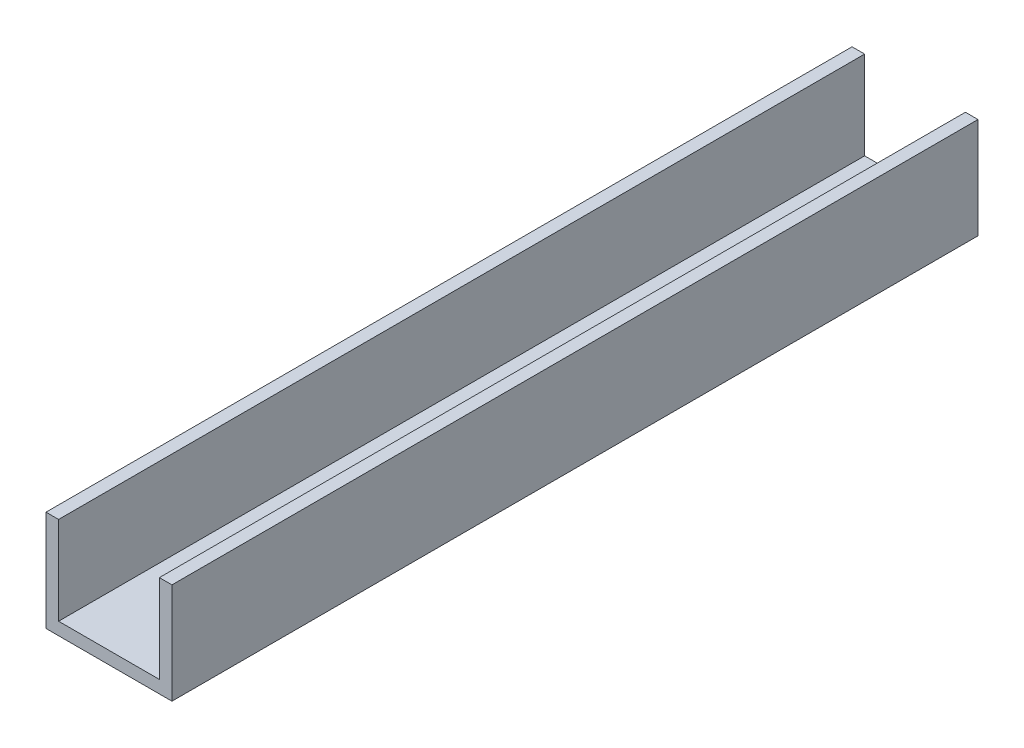
ISO-10303-21;
HEADER;
FILE_DESCRIPTION(('STEP AP214'),'2;1');
FILE_NAME('part.step','',(''),(''),'','','');
FILE_SCHEMA(('AUTOMOTIVE_DESIGN { 1 0 10303 214 1 1 1 1 }'));
ENDSEC;
DATA;
#1=APPLICATION_CONTEXT('core data for automotive mechanical design processes');
#2=APPLICATION_PROTOCOL_DEFINITION('international standard','automotive_design',2000,#1);
#3=PRODUCT_CONTEXT('',#1,'mechanical');
#4=PRODUCT('Part','Part','',(#3));
#5=PRODUCT_RELATED_PRODUCT_CATEGORY('part','',(#4));
#6=PRODUCT_DEFINITION_FORMATION('','',#4);
#7=PRODUCT_DEFINITION_CONTEXT('part definition',#1,'design');
#8=PRODUCT_DEFINITION('design','',#6,#7);
#9=PRODUCT_DEFINITION_SHAPE('','',#8);
#10=(LENGTH_UNIT() NAMED_UNIT(*) SI_UNIT(.MILLI.,.METRE.));
#11=(NAMED_UNIT(*) PLANE_ANGLE_UNIT() SI_UNIT($,.RADIAN.));
#12=(NAMED_UNIT(*) SI_UNIT($,.STERADIAN.) SOLID_ANGLE_UNIT());
#13=UNCERTAINTY_MEASURE_WITH_UNIT(LENGTH_MEASURE(1.E-05),#10,'distance_accuracy_value','');
#14=(GEOMETRIC_REPRESENTATION_CONTEXT(3) GLOBAL_UNCERTAINTY_ASSIGNED_CONTEXT((#13)) GLOBAL_UNIT_ASSIGNED_CONTEXT((#10,
#11,#12)) REPRESENTATION_CONTEXT('',''));
#15=CARTESIAN_POINT('',(0.,0.,0.));
#16=DIRECTION('',(0.,0.,1.));
#17=DIRECTION('',(1.,0.,0.));
#18=AXIS2_PLACEMENT_3D('',#15,#16,#17);
#19=CARTESIAN_POINT('',(-12.7,12.7,609.6));
#20=DIRECTION('',(0.,-1.,0.));
#21=DIRECTION('',(1.,0.,0.));
#22=AXIS2_PLACEMENT_3D('',#19,#20,#21);
#23=PLANE('',#22);
#24=DIRECTION('',(0.,0.,-1.));
#25=VECTOR('',#24,1.);
#26=CARTESIAN_POINT('',(-15.875,12.7,609.6));
#27=LINE('',#26,#25);
#28=CARTESIAN_POINT('',(-15.875,12.7,-406.4));
#29=VERTEX_POINT('',#28);
#30=CARTESIAN_POINT('',(-15.875,12.7,-609.6));
#31=VERTEX_POINT('',#30);
#32=EDGE_CURVE('E11',#29,#31,#27,.T.);
#33=ORIENTED_EDGE('',*,*,#32,.F.);
#34=DIRECTION('',(-1.,0.,0.));
#35=VECTOR('',#34,1.);
#36=CARTESIAN_POINT('',(-15.875,12.7,-406.4));
#37=LINE('',#36,#35);
#38=CARTESIAN_POINT('',(-12.7,12.7,-406.4));
#39=VERTEX_POINT('',#38);
#40=EDGE_CURVE('E113',#39,#29,#37,.T.);
#41=ORIENTED_EDGE('',*,*,#40,.F.);
#42=DIRECTION('',(0.,0.,-1.));
#43=VECTOR('',#42,1.);
#44=CARTESIAN_POINT('',(-12.7,12.7,609.6));
#45=LINE('',#44,#43);
#46=CARTESIAN_POINT('',(-12.7,12.7,-609.6));
#47=VERTEX_POINT('',#46);
#48=EDGE_CURVE('E67',#39,#47,#45,.T.);
#49=ORIENTED_EDGE('',*,*,#48,.T.);
#50=DIRECTION('',(-1.,0.,0.));
#51=VECTOR('',#50,1.);
#52=CARTESIAN_POINT('',(-12.7,12.7,-609.6));
#53=LINE('',#52,#51);
#54=EDGE_CURVE('E175',#47,#31,#53,.T.);
#55=ORIENTED_EDGE('',*,*,#54,.T.);
#56=EDGE_LOOP('',(#33,#41,#49,#55));
#57=FACE_BOUND('',#56,.T.);
#58=ADVANCED_FACE('F44',(#57),#23,.F.);
#59=CARTESIAN_POINT('',(-15.875,12.7,609.6));
#60=DIRECTION('',(1.,0.,0.));
#61=DIRECTION('',(0.,1.,0.));
#62=AXIS2_PLACEMENT_3D('',#59,#60,#61);
#63=PLANE('',#62);
#64=DIRECTION('',(0.,0.,-1.));
#65=VECTOR('',#64,1.);
#66=CARTESIAN_POINT('',(-15.875,-12.7,609.6));
#67=LINE('',#66,#65);
#68=CARTESIAN_POINT('',(-15.875,-12.7,-406.4));
#69=VERTEX_POINT('',#68);
#70=CARTESIAN_POINT('',(-15.875,-12.7,-609.6));
#71=VERTEX_POINT('',#70);
#72=EDGE_CURVE('E52',#69,#71,#67,.T.);
#73=ORIENTED_EDGE('',*,*,#72,.F.);
#74=DIRECTION('',(0.,-1.,0.));
#75=VECTOR('',#74,1.);
#76=CARTESIAN_POINT('',(-15.875,-12.7,-406.4));
#77=LINE('',#76,#75);
#78=EDGE_CURVE('E108',#29,#69,#77,.T.);
#79=ORIENTED_EDGE('',*,*,#78,.F.);
#80=ORIENTED_EDGE('',*,*,#32,.T.);
#81=DIRECTION('',(0.,-1.,0.));
#82=VECTOR('',#81,1.);
#83=CARTESIAN_POINT('',(-15.875,12.7,-609.6));
#84=LINE('',#83,#82);
#85=EDGE_CURVE('E131',#31,#71,#84,.T.);
#86=ORIENTED_EDGE('',*,*,#85,.T.);
#87=EDGE_LOOP('',(#73,#79,#80,#86));
#88=FACE_BOUND('',#87,.T.);
#89=ADVANCED_FACE('F129',(#88),#63,.F.);
#90=CARTESIAN_POINT('',(-15.875,-12.7,609.6));
#91=DIRECTION('',(0.,1.,0.));
#92=DIRECTION('',(0.,0.,1.));
#93=AXIS2_PLACEMENT_3D('',#90,#91,#92);
#94=PLANE('',#93);
#95=CARTESIAN_POINT('',(0.,-12.7,-594.6));
#96=DIRECTION('',(0.,1.,0.));
#97=DIRECTION('',(0.,0.,1.));
#98=AXIS2_PLACEMENT_3D('',#95,#96,#97);
#99=CIRCLE('',#98,3.2);
#100=CARTESIAN_POINT('',(0.,-12.7,-591.4));
#101=VERTEX_POINT('',#100);
#102=EDGE_CURVE('E118',#101,#101,#99,.T.);
#103=ORIENTED_EDGE('',*,*,#102,.T.);
#104=EDGE_LOOP('',(#103));
#105=FACE_BOUND('',#104,.T.);
#106=DIRECTION('',(0.,0.,-1.));
#107=VECTOR('',#106,1.);
#108=CARTESIAN_POINT('',(15.875,-12.7,609.6));
#109=LINE('',#108,#107);
#110=CARTESIAN_POINT('',(15.875,-12.7,-406.4));
#111=VERTEX_POINT('',#110);
#112=CARTESIAN_POINT('',(15.875,-12.7,-609.6));
#113=VERTEX_POINT('',#112);
#114=EDGE_CURVE('E125',#111,#113,#109,.T.);
#115=ORIENTED_EDGE('',*,*,#114,.F.);
#116=DIRECTION('',(1.,0.,0.));
#117=VECTOR('',#116,1.);
#118=CARTESIAN_POINT('',(15.875,-12.7,-406.4));
#119=LINE('',#118,#117);
#120=EDGE_CURVE('E111',#69,#111,#119,.T.);
#121=ORIENTED_EDGE('',*,*,#120,.F.);
#122=ORIENTED_EDGE('',*,*,#72,.T.);
#123=DIRECTION('',(1.,0.,0.));
#124=VECTOR('',#123,1.);
#125=CARTESIAN_POINT('',(-15.875,-12.7,-609.6));
#126=LINE('',#125,#124);
#127=EDGE_CURVE('E170',#71,#113,#126,.T.);
#128=ORIENTED_EDGE('',*,*,#127,.T.);
#129=EDGE_LOOP('',(#115,#121,#122,#128));
#130=FACE_BOUND('',#129,.T.);
#131=ADVANCED_FACE('F122',(#105,#130),#94,.F.);
#132=CARTESIAN_POINT('',(15.875,-12.7,609.6));
#133=DIRECTION('',(-1.,0.,0.));
#134=DIRECTION('',(0.,-1.,0.));
#135=AXIS2_PLACEMENT_3D('',#132,#133,#134);
#136=PLANE('',#135);
#137=DIRECTION('',(0.,0.,-1.));
#138=VECTOR('',#137,1.);
#139=CARTESIAN_POINT('',(15.875,12.7,609.6));
#140=LINE('',#139,#138);
#141=CARTESIAN_POINT('',(15.875,12.7,-406.4));
#142=VERTEX_POINT('',#141);
#143=CARTESIAN_POINT('',(15.875,12.7,-609.6));
#144=VERTEX_POINT('',#143);
#145=EDGE_CURVE('E135',#142,#144,#140,.T.);
#146=ORIENTED_EDGE('',*,*,#145,.F.);
#147=DIRECTION('',(0.,1.,0.));
#148=VECTOR('',#147,1.);
#149=CARTESIAN_POINT('',(15.875,12.7,-406.4));
#150=LINE('',#149,#148);
#151=EDGE_CURVE('E127',#111,#142,#150,.T.);
#152=ORIENTED_EDGE('',*,*,#151,.F.);
#153=ORIENTED_EDGE('',*,*,#114,.T.);
#154=DIRECTION('',(0.,1.,0.));
#155=VECTOR('',#154,1.);
#156=CARTESIAN_POINT('',(15.875,-12.7,-609.6));
#157=LINE('',#156,#155);
#158=EDGE_CURVE('E166',#113,#144,#157,.T.);
#159=ORIENTED_EDGE('',*,*,#158,.T.);
#160=EDGE_LOOP('',(#146,#152,#153,#159));
#161=FACE_BOUND('',#160,.T.);
#162=ADVANCED_FACE('F222',(#161),#136,.F.);
#163=CARTESIAN_POINT('',(15.875,12.7,609.6));
#164=DIRECTION('',(0.,-1.,0.));
#165=DIRECTION('',(0.,0.,-1.));
#166=AXIS2_PLACEMENT_3D('',#163,#164,#165);
#167=PLANE('',#166);
#168=DIRECTION('',(0.,0.,-1.));
#169=VECTOR('',#168,1.);
#170=CARTESIAN_POINT('',(12.7,12.7,609.6));
#171=LINE('',#170,#169);
#172=CARTESIAN_POINT('',(12.7,12.7,-406.4));
#173=VERTEX_POINT('',#172);
#174=CARTESIAN_POINT('',(12.7,12.7,-609.6));
#175=VERTEX_POINT('',#174);
#176=EDGE_CURVE('E140',#173,#175,#171,.T.);
#177=ORIENTED_EDGE('',*,*,#176,.F.);
#178=DIRECTION('',(-1.,0.,0.));
#179=VECTOR('',#178,1.);
#180=CARTESIAN_POINT('',(12.7,12.7,-406.4));
#181=LINE('',#180,#179);
#182=EDGE_CURVE('E188',#142,#173,#181,.T.);
#183=ORIENTED_EDGE('',*,*,#182,.F.);
#184=ORIENTED_EDGE('',*,*,#145,.T.);
#185=DIRECTION('',(-1.,0.,0.));
#186=VECTOR('',#185,1.);
#187=CARTESIAN_POINT('',(15.875,12.7,-609.6));
#188=LINE('',#187,#186);
#189=EDGE_CURVE('E162',#144,#175,#188,.T.);
#190=ORIENTED_EDGE('',*,*,#189,.T.);
#191=EDGE_LOOP('',(#177,#183,#184,#190));
#192=FACE_BOUND('',#191,.T.);
#193=ADVANCED_FACE('F227',(#192),#167,.F.);
#194=CARTESIAN_POINT('',(12.7,12.7,609.6));
#195=DIRECTION('',(1.,0.,0.));
#196=DIRECTION('',(0.,0.,-1.));
#197=AXIS2_PLACEMENT_3D('',#194,#195,#196);
#198=PLANE('',#197);
#199=DIRECTION('',(0.,0.,-1.));
#200=VECTOR('',#199,1.);
#201=CARTESIAN_POINT('',(12.7,-9.52499999999998,609.6));
#202=LINE('',#201,#200);
#203=CARTESIAN_POINT('',(12.7,-9.52499999999998,-406.4));
#204=VERTEX_POINT('',#203);
#205=CARTESIAN_POINT('',(12.7,-9.52499999999998,-609.6));
#206=VERTEX_POINT('',#205);
#207=EDGE_CURVE('E143',#204,#206,#202,.T.);
#208=ORIENTED_EDGE('',*,*,#207,.F.);
#209=DIRECTION('',(0.,-1.,0.));
#210=VECTOR('',#209,1.);
#211=CARTESIAN_POINT('',(12.7,-9.52499999999998,-406.4));
#212=LINE('',#211,#210);
#213=EDGE_CURVE('E185',#173,#204,#212,.T.);
#214=ORIENTED_EDGE('',*,*,#213,.F.);
#215=ORIENTED_EDGE('',*,*,#176,.T.);
#216=DIRECTION('',(0.,-1.,0.));
#217=VECTOR('',#216,1.);
#218=CARTESIAN_POINT('',(12.7,12.7,-609.6));
#219=LINE('',#218,#217);
#220=EDGE_CURVE('E158',#175,#206,#219,.T.);
#221=ORIENTED_EDGE('',*,*,#220,.T.);
#222=EDGE_LOOP('',(#208,#214,#215,#221));
#223=FACE_BOUND('',#222,.T.);
#224=ADVANCED_FACE('F207',(#223),#198,.F.);
#225=CARTESIAN_POINT('',(12.7,-9.52499999999998,609.6));
#226=DIRECTION('',(0.,-1.,0.));
#227=DIRECTION('',(1.,0.,0.));
#228=AXIS2_PLACEMENT_3D('',#225,#226,#227);
#229=PLANE('',#228);
#230=CARTESIAN_POINT('',(0.,-9.52499999999998,-594.6));
#231=DIRECTION('',(0.,1.,0.));
#232=DIRECTION('',(0.,0.,1.));
#233=AXIS2_PLACEMENT_3D('',#230,#231,#232);
#234=CIRCLE('',#233,3.2);
#235=CARTESIAN_POINT('',(0.,-9.52499999999998,-591.4));
#236=VERTEX_POINT('',#235);
#237=EDGE_CURVE('E196',#236,#236,#234,.T.);
#238=ORIENTED_EDGE('',*,*,#237,.F.);
#239=EDGE_LOOP('',(#238));
#240=FACE_BOUND('',#239,.T.);
#241=DIRECTION('',(0.,0.,-1.));
#242=VECTOR('',#241,1.);
#243=CARTESIAN_POINT('',(-12.7,-9.52499999999999,609.6));
#244=LINE('',#243,#242);
#245=CARTESIAN_POINT('',(-12.7,-9.52499999999999,-406.4));
#246=VERTEX_POINT('',#245);
#247=CARTESIAN_POINT('',(-12.7,-9.52499999999999,-609.6));
#248=VERTEX_POINT('',#247);
#249=EDGE_CURVE('E146',#246,#248,#244,.T.);
#250=ORIENTED_EDGE('',*,*,#249,.F.);
#251=DIRECTION('',(-1.,0.,0.));
#252=VECTOR('',#251,1.);
#253=CARTESIAN_POINT('',(-12.7,-9.52499999999999,-406.4));
#254=LINE('',#253,#252);
#255=EDGE_CURVE('E59',#204,#246,#254,.T.);
#256=ORIENTED_EDGE('',*,*,#255,.F.);
#257=ORIENTED_EDGE('',*,*,#207,.T.);
#258=DIRECTION('',(-1.,0.,0.));
#259=VECTOR('',#258,1.);
#260=CARTESIAN_POINT('',(12.7,-9.52499999999998,-609.6));
#261=LINE('',#260,#259);
#262=EDGE_CURVE('E154',#206,#248,#261,.T.);
#263=ORIENTED_EDGE('',*,*,#262,.T.);
#264=EDGE_LOOP('',(#250,#256,#257,#263));
#265=FACE_BOUND('',#264,.T.);
#266=ADVANCED_FACE('F203',(#240,#265),#229,.F.);
#267=CARTESIAN_POINT('',(-12.7,-9.52499999999999,609.6));
#268=DIRECTION('',(-1.,0.,0.));
#269=DIRECTION('',(0.,0.,1.));
#270=AXIS2_PLACEMENT_3D('',#267,#268,#269);
#271=PLANE('',#270);
#272=ORIENTED_EDGE('',*,*,#48,.F.);
#273=DIRECTION('',(0.,1.,0.));
#274=VECTOR('',#273,1.);
#275=CARTESIAN_POINT('',(-12.7,12.7,-406.4));
#276=LINE('',#275,#274);
#277=EDGE_CURVE('E180',#246,#39,#276,.T.);
#278=ORIENTED_EDGE('',*,*,#277,.F.);
#279=ORIENTED_EDGE('',*,*,#249,.T.);
#280=DIRECTION('',(0.,1.,0.));
#281=VECTOR('',#280,1.);
#282=CARTESIAN_POINT('',(-12.7,-9.52499999999999,-609.6));
#283=LINE('',#282,#281);
#284=EDGE_CURVE('E151',#248,#47,#283,.T.);
#285=ORIENTED_EDGE('',*,*,#284,.T.);
#286=EDGE_LOOP('',(#272,#278,#279,#285));
#287=FACE_BOUND('',#286,.T.);
#288=ADVANCED_FACE('F206',(#287),#271,.F.);
#289=CARTESIAN_POINT('',(0.,0.,-609.6));
#290=DIRECTION('',(0.,0.,1.));
#291=DIRECTION('',(1.,0.,0.));
#292=AXIS2_PLACEMENT_3D('',#289,#290,#291);
#293=PLANE('',#292);
#294=ORIENTED_EDGE('',*,*,#54,.F.);
#295=ORIENTED_EDGE('',*,*,#284,.F.);
#296=ORIENTED_EDGE('',*,*,#262,.F.);
#297=ORIENTED_EDGE('',*,*,#220,.F.);
#298=ORIENTED_EDGE('',*,*,#189,.F.);
#299=ORIENTED_EDGE('',*,*,#158,.F.);
#300=ORIENTED_EDGE('',*,*,#127,.F.);
#301=ORIENTED_EDGE('',*,*,#85,.F.);
#302=EDGE_LOOP('',(#294,#295,#296,#297,#298,#299,#300,#301));
#303=FACE_BOUND('',#302,.T.);
#304=ADVANCED_FACE('F216',(#303),#293,.F.);
#305=CARTESIAN_POINT('',(0.,0.,-406.4));
#306=DIRECTION('',(0.,0.,-1.));
#307=DIRECTION('',(-1.,0.,0.));
#308=AXIS2_PLACEMENT_3D('',#305,#306,#307);
#309=PLANE('',#308);
#310=ORIENTED_EDGE('',*,*,#78,.T.);
#311=ORIENTED_EDGE('',*,*,#120,.T.);
#312=ORIENTED_EDGE('',*,*,#151,.T.);
#313=ORIENTED_EDGE('',*,*,#182,.T.);
#314=ORIENTED_EDGE('',*,*,#213,.T.);
#315=ORIENTED_EDGE('',*,*,#255,.T.);
#316=ORIENTED_EDGE('',*,*,#277,.T.);
#317=ORIENTED_EDGE('',*,*,#40,.T.);
#318=EDGE_LOOP('',(#310,#311,#312,#313,#314,#315,#316,#317));
#319=FACE_BOUND('',#318,.T.);
#320=ADVANCED_FACE('F110',(#319),#309,.F.);
#321=CARTESIAN_POINT('',(0.,-9.52499999999998,-594.6));
#322=DIRECTION('',(0.,1.,0.));
#323=DIRECTION('',(0.,0.,1.));
#324=AXIS2_PLACEMENT_3D('',#321,#322,#323);
#325=CYLINDRICAL_SURFACE('',#324,3.2);
#326=ORIENTED_EDGE('',*,*,#102,.F.);
#327=EDGE_LOOP('',(#326));
#328=FACE_BOUND('',#327,.T.);
#329=ORIENTED_EDGE('',*,*,#237,.T.);
#330=EDGE_LOOP('',(#329));
#331=FACE_BOUND('',#330,.T.);
#332=ADVANCED_FACE('F201',(#328,#331),#325,.F.);
#333=CLOSED_SHELL('',(#58,#89,#131,#162,#193,#224,#266,#288,#304,#320,#332));
#334=MANIFOLD_SOLID_BREP('B2',#333);
#335=ADVANCED_BREP_SHAPE_REPRESENTATION('',(#18,#334),#14);
#336=SHAPE_DEFINITION_REPRESENTATION(#9,#335);
ENDSEC;
END-ISO-10303-21;
